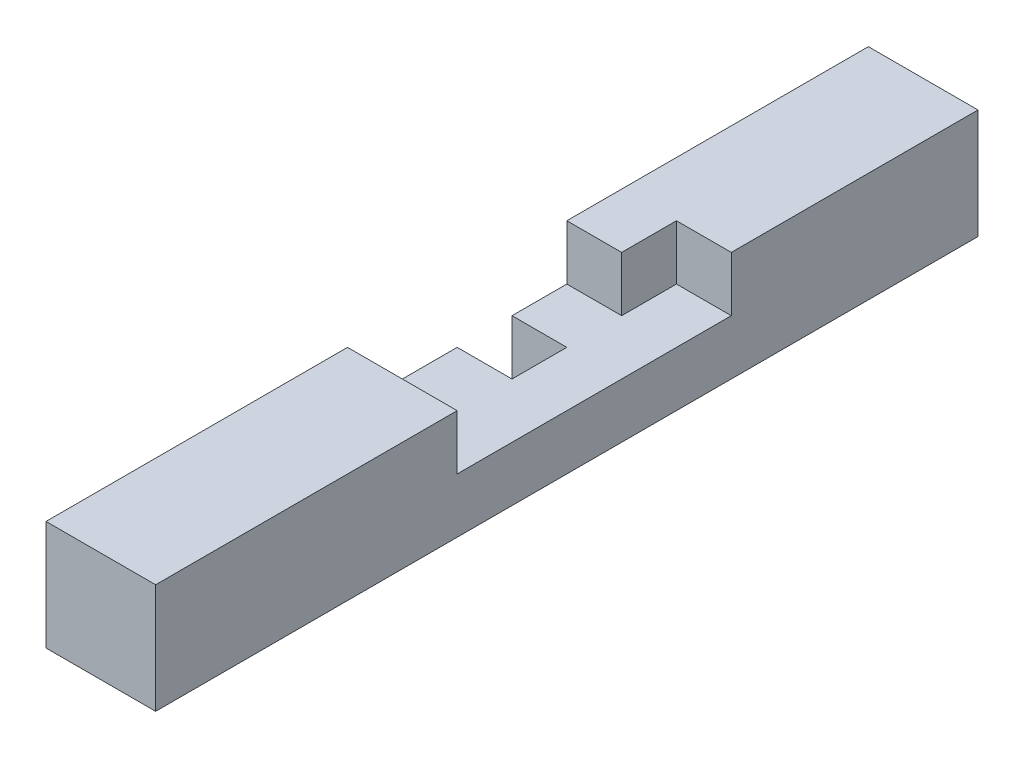
ISO-10303-21;
HEADER;
FILE_DESCRIPTION(('STEP AP214'),'2;1');
FILE_NAME('part.step','',(''),(''),'','','');
FILE_SCHEMA(('AUTOMOTIVE_DESIGN { 1 0 10303 214 1 1 1 1 }'));
ENDSEC;
DATA;
#1=APPLICATION_CONTEXT('core data for automotive mechanical design processes');
#2=APPLICATION_PROTOCOL_DEFINITION('international standard','automotive_design',2000,#1);
#3=PRODUCT_CONTEXT('',#1,'mechanical');
#4=PRODUCT('Part','Part','',(#3));
#5=PRODUCT_RELATED_PRODUCT_CATEGORY('part','',(#4));
#6=PRODUCT_DEFINITION_FORMATION('','',#4);
#7=PRODUCT_DEFINITION_CONTEXT('part definition',#1,'design');
#8=PRODUCT_DEFINITION('design','',#6,#7);
#9=PRODUCT_DEFINITION_SHAPE('','',#8);
#10=(LENGTH_UNIT() NAMED_UNIT(*) SI_UNIT(.MILLI.,.METRE.));
#11=(NAMED_UNIT(*) PLANE_ANGLE_UNIT() SI_UNIT($,.RADIAN.));
#12=(NAMED_UNIT(*) SI_UNIT($,.STERADIAN.) SOLID_ANGLE_UNIT());
#13=UNCERTAINTY_MEASURE_WITH_UNIT(LENGTH_MEASURE(1.E-05),#10,'distance_accuracy_value','');
#14=(GEOMETRIC_REPRESENTATION_CONTEXT(3) GLOBAL_UNCERTAINTY_ASSIGNED_CONTEXT((#13)) GLOBAL_UNIT_ASSIGNED_CONTEXT((#10,
#11,#12)) REPRESENTATION_CONTEXT('',''));
#15=CARTESIAN_POINT('',(0.,0.,0.));
#16=DIRECTION('',(0.,0.,1.));
#17=DIRECTION('',(1.,0.,0.));
#18=AXIS2_PLACEMENT_3D('',#15,#16,#17);
#19=CARTESIAN_POINT('',(0.,0.,11.));
#20=DIRECTION('',(0.,0.,-1.));
#21=DIRECTION('',(-1.,0.,0.));
#22=AXIS2_PLACEMENT_3D('',#19,#20,#21);
#23=PLANE('',#22);
#24=DIRECTION('',(-1.,0.,0.));
#25=VECTOR('',#24,1.);
#26=CARTESIAN_POINT('',(0.,0.,11.));
#27=LINE('',#26,#25);
#28=CARTESIAN_POINT('',(0.,0.,11.));
#29=VERTEX_POINT('',#28);
#30=CARTESIAN_POINT('',(-2.,0.,11.));
#31=VERTEX_POINT('',#30);
#32=EDGE_CURVE('E147',#29,#31,#27,.T.);
#33=ORIENTED_EDGE('',*,*,#32,.F.);
#34=DIRECTION('',(0.,1.,0.));
#35=VECTOR('',#34,1.);
#36=CARTESIAN_POINT('',(0.,2.,11.));
#37=LINE('',#36,#35);
#38=CARTESIAN_POINT('',(0.,2.,11.));
#39=VERTEX_POINT('',#38);
#40=EDGE_CURVE('E412',#29,#39,#37,.T.);
#41=ORIENTED_EDGE('',*,*,#40,.T.);
#42=DIRECTION('',(-1.,0.,0.));
#43=VECTOR('',#42,1.);
#44=CARTESIAN_POINT('',(0.,2.,11.));
#45=LINE('',#44,#43);
#46=CARTESIAN_POINT('',(-2.,2.,11.));
#47=VERTEX_POINT('',#46);
#48=EDGE_CURVE('E165',#39,#47,#45,.T.);
#49=ORIENTED_EDGE('',*,*,#48,.T.);
#50=DIRECTION('',(0.,-1.,0.));
#51=VECTOR('',#50,1.);
#52=CARTESIAN_POINT('',(-2.,0.,11.));
#53=LINE('',#52,#51);
#54=EDGE_CURVE('E161',#47,#31,#53,.T.);
#55=ORIENTED_EDGE('',*,*,#54,.T.);
#56=EDGE_LOOP('',(#33,#41,#49,#55));
#57=FACE_BOUND('',#56,.T.);
#58=ADVANCED_FACE('F33',(#57),#23,.F.);
#59=CARTESIAN_POINT('',(0.,0.,0.));
#60=DIRECTION('',(-1.,0.,0.));
#61=DIRECTION('',(0.,-1.,0.));
#62=AXIS2_PLACEMENT_3D('',#59,#60,#61);
#63=PLANE('',#62);
#64=DIRECTION('',(0.,0.,1.));
#65=VECTOR('',#64,1.);
#66=CARTESIAN_POINT('',(0.,0.,11.));
#67=LINE('',#66,#65);
#68=CARTESIAN_POINT('',(0.,0.,13.));
#69=VERTEX_POINT('',#68);
#70=CARTESIAN_POINT('',(0.,0.,15.));
#71=VERTEX_POINT('',#70);
#72=EDGE_CURVE('E56',#69,#71,#67,.T.);
#73=ORIENTED_EDGE('',*,*,#72,.F.);
#74=DIRECTION('',(0.,1.,0.));
#75=VECTOR('',#74,1.);
#76=CARTESIAN_POINT('',(0.,0.,13.));
#77=LINE('',#76,#75);
#78=CARTESIAN_POINT('',(0.,-2.,13.));
#79=VERTEX_POINT('',#78);
#80=EDGE_CURVE('E142',#79,#69,#77,.T.);
#81=ORIENTED_EDGE('',*,*,#80,.F.);
#82=DIRECTION('',(0.,0.,1.));
#83=VECTOR('',#82,1.);
#84=CARTESIAN_POINT('',(0.,-2.,11.));
#85=LINE('',#84,#83);
#86=CARTESIAN_POINT('',(0.,-2.,15.));
#87=VERTEX_POINT('',#86);
#88=EDGE_CURVE('E157',#79,#87,#85,.T.);
#89=ORIENTED_EDGE('',*,*,#88,.T.);
#90=DIRECTION('',(0.,-1.,0.));
#91=VECTOR('',#90,1.);
#92=CARTESIAN_POINT('',(0.,0.,15.));
#93=LINE('',#92,#91);
#94=EDGE_CURVE('E151',#71,#87,#93,.T.);
#95=ORIENTED_EDGE('',*,*,#94,.F.);
#96=EDGE_LOOP('',(#73,#81,#89,#95));
#97=FACE_BOUND('',#96,.T.);
#98=ADVANCED_FACE('F149',(#97),#63,.T.);
#99=CARTESIAN_POINT('',(2.,2.,9.));
#100=DIRECTION('',(0.,0.,-1.));
#101=DIRECTION('',(-1.,0.,0.));
#102=AXIS2_PLACEMENT_3D('',#99,#100,#101);
#103=PLANE('',#102);
#104=DIRECTION('',(0.,-1.,0.));
#105=VECTOR('',#104,1.);
#106=CARTESIAN_POINT('',(0.,2.,9.));
#107=LINE('',#106,#105);
#108=CARTESIAN_POINT('',(0.,2.,9.));
#109=VERTEX_POINT('',#108);
#110=CARTESIAN_POINT('',(0.,0.,9.));
#111=VERTEX_POINT('',#110);
#112=EDGE_CURVE('E409',#109,#111,#107,.T.);
#113=ORIENTED_EDGE('',*,*,#112,.T.);
#114=DIRECTION('',(-1.,0.,0.));
#115=VECTOR('',#114,1.);
#116=CARTESIAN_POINT('',(2.,0.,9.));
#117=LINE('',#116,#115);
#118=CARTESIAN_POINT('',(2.,0.,9.));
#119=VERTEX_POINT('',#118);
#120=EDGE_CURVE('E180',#119,#111,#117,.T.);
#121=ORIENTED_EDGE('',*,*,#120,.F.);
#122=DIRECTION('',(0.,-1.,0.));
#123=VECTOR('',#122,1.);
#124=CARTESIAN_POINT('',(2.,2.,9.));
#125=LINE('',#124,#123);
#126=CARTESIAN_POINT('',(2.,2.,9.));
#127=VERTEX_POINT('',#126);
#128=EDGE_CURVE('E170',#127,#119,#125,.T.);
#129=ORIENTED_EDGE('',*,*,#128,.F.);
#130=DIRECTION('',(-1.,0.,0.));
#131=VECTOR('',#130,1.);
#132=CARTESIAN_POINT('',(2.,2.,9.));
#133=LINE('',#132,#131);
#134=EDGE_CURVE('E183',#127,#109,#133,.T.);
#135=ORIENTED_EDGE('',*,*,#134,.T.);
#136=EDGE_LOOP('',(#113,#121,#129,#135));
#137=FACE_BOUND('',#136,.T.);
#138=ADVANCED_FACE('F261',(#137),#103,.F.);
#139=CARTESIAN_POINT('',(2.,0.,9.));
#140=DIRECTION('',(0.,-1.,0.));
#141=DIRECTION('',(1.,0.,0.));
#142=AXIS2_PLACEMENT_3D('',#139,#140,#141);
#143=PLANE('',#142);
#144=DIRECTION('',(0.,0.,1.));
#145=VECTOR('',#144,1.);
#146=CARTESIAN_POINT('',(0.,0.,9.));
#147=LINE('',#146,#145);
#148=EDGE_CURVE('E407',#111,#29,#147,.T.);
#149=ORIENTED_EDGE('',*,*,#148,.T.);
#150=ORIENTED_EDGE('',*,*,#32,.T.);
#151=DIRECTION('',(0.,0.,-1.));
#152=VECTOR('',#151,1.);
#153=CARTESIAN_POINT('',(-2.,0.,13.));
#154=LINE('',#153,#152);
#155=CARTESIAN_POINT('',(-2.,0.,13.));
#156=VERTEX_POINT('',#155);
#157=EDGE_CURVE('E139',#156,#31,#154,.T.);
#158=ORIENTED_EDGE('',*,*,#157,.F.);
#159=DIRECTION('',(-1.,0.,0.));
#160=VECTOR('',#159,1.);
#161=CARTESIAN_POINT('',(0.,0.,13.));
#162=LINE('',#161,#160);
#163=EDGE_CURVE('E135',#69,#156,#162,.T.);
#164=ORIENTED_EDGE('',*,*,#163,.F.);
#165=ORIENTED_EDGE('',*,*,#72,.T.);
#166=DIRECTION('',(-1.,0.,0.));
#167=VECTOR('',#166,1.);
#168=CARTESIAN_POINT('',(0.,0.,15.));
#169=LINE('',#168,#167);
#170=CARTESIAN_POINT('',(-2.,0.,15.));
#171=VERTEX_POINT('',#170);
#172=EDGE_CURVE('E155',#71,#171,#169,.T.);
#173=ORIENTED_EDGE('',*,*,#172,.T.);
#174=DIRECTION('',(0.,0.,1.));
#175=VECTOR('',#174,1.);
#176=CARTESIAN_POINT('',(-2.,0.,9.));
#177=LINE('',#176,#175);
#178=CARTESIAN_POINT('',(-2.,0.,19.));
#179=VERTEX_POINT('',#178);
#180=EDGE_CURVE('E168',#171,#179,#177,.T.);
#181=ORIENTED_EDGE('',*,*,#180,.T.);
#182=DIRECTION('',(-1.,0.,0.));
#183=VECTOR('',#182,1.);
#184=CARTESIAN_POINT('',(2.,0.,19.));
#185=LINE('',#184,#183);
#186=CARTESIAN_POINT('',(2.,0.,19.));
#187=VERTEX_POINT('',#186);
#188=EDGE_CURVE('E190',#187,#179,#185,.T.);
#189=ORIENTED_EDGE('',*,*,#188,.F.);
#190=DIRECTION('',(0.,0.,1.));
#191=VECTOR('',#190,1.);
#192=CARTESIAN_POINT('',(2.,0.,9.));
#193=LINE('',#192,#191);
#194=EDGE_CURVE('E173',#119,#187,#193,.T.);
#195=ORIENTED_EDGE('',*,*,#194,.F.);
#196=ORIENTED_EDGE('',*,*,#120,.T.);
#197=EDGE_LOOP('',(#149,#150,#158,#164,#165,#173,#181,#189,#195,#196));
#198=FACE_BOUND('',#197,.T.);
#199=ADVANCED_FACE('F137',(#198),#143,.F.);
#200=CARTESIAN_POINT('',(-2.,2.,30.));
#201=DIRECTION('',(1.,0.,0.));
#202=DIRECTION('',(0.,1.,0.));
#203=AXIS2_PLACEMENT_3D('',#200,#201,#202);
#204=PLANE('',#203);
#205=DIRECTION('',(0.,-1.,0.));
#206=VECTOR('',#205,1.);
#207=CARTESIAN_POINT('',(-2.,0.,15.));
#208=LINE('',#207,#206);
#209=CARTESIAN_POINT('',(-2.,-2.,15.));
#210=VERTEX_POINT('',#209);
#211=EDGE_CURVE('E164',#171,#210,#208,.T.);
#212=ORIENTED_EDGE('',*,*,#211,.T.);
#213=DIRECTION('',(0.,0.,-1.));
#214=VECTOR('',#213,1.);
#215=CARTESIAN_POINT('',(-2.,-2.,30.));
#216=LINE('',#215,#214);
#217=CARTESIAN_POINT('',(-2.,-2.,30.));
#218=VERTEX_POINT('',#217);
#219=EDGE_CURVE('E11',#218,#210,#216,.T.);
#220=ORIENTED_EDGE('',*,*,#219,.F.);
#221=DIRECTION('',(0.,-1.,0.));
#222=VECTOR('',#221,1.);
#223=CARTESIAN_POINT('',(-2.,2.,30.));
#224=LINE('',#223,#222);
#225=CARTESIAN_POINT('',(-2.,2.,30.));
#226=VERTEX_POINT('',#225);
#227=EDGE_CURVE('E195',#226,#218,#224,.T.);
#228=ORIENTED_EDGE('',*,*,#227,.F.);
#229=DIRECTION('',(0.,0.,-1.));
#230=VECTOR('',#229,1.);
#231=CARTESIAN_POINT('',(-2.,2.,30.));
#232=LINE('',#231,#230);
#233=CARTESIAN_POINT('',(-2.,2.,19.));
#234=VERTEX_POINT('',#233);
#235=EDGE_CURVE('E218',#226,#234,#232,.T.);
#236=ORIENTED_EDGE('',*,*,#235,.T.);
#237=DIRECTION('',(0.,1.,0.));
#238=VECTOR('',#237,1.);
#239=CARTESIAN_POINT('',(-2.,2.,19.));
#240=LINE('',#239,#238);
#241=EDGE_CURVE('E174',#179,#234,#240,.T.);
#242=ORIENTED_EDGE('',*,*,#241,.F.);
#243=ORIENTED_EDGE('',*,*,#180,.F.);
#244=EDGE_LOOP('',(#212,#220,#228,#236,#242,#243));
#245=FACE_BOUND('',#244,.T.);
#246=ADVANCED_FACE('F272',(#245),#204,.F.);
#247=CARTESIAN_POINT('',(-2.,2.,30.));
#248=DIRECTION('',(0.,1.,0.));
#249=DIRECTION('',(0.,0.,1.));
#250=AXIS2_PLACEMENT_3D('',#247,#248,#249);
#251=PLANE('',#250);
#252=ORIENTED_EDGE('',*,*,#134,.F.);
#253=DIRECTION('',(0.,0.,-1.));
#254=VECTOR('',#253,1.);
#255=CARTESIAN_POINT('',(2.,2.,30.));
#256=LINE('',#255,#254);
#257=CARTESIAN_POINT('',(2.,2.,0.));
#258=VERTEX_POINT('',#257);
#259=EDGE_CURVE('E221',#127,#258,#256,.T.);
#260=ORIENTED_EDGE('',*,*,#259,.T.);
#261=DIRECTION('',(1.,0.,0.));
#262=VECTOR('',#261,1.);
#263=CARTESIAN_POINT('',(-2.,2.,0.));
#264=LINE('',#263,#262);
#265=CARTESIAN_POINT('',(-2.,2.,0.));
#266=VERTEX_POINT('',#265);
#267=EDGE_CURVE('E199',#266,#258,#264,.T.);
#268=ORIENTED_EDGE('',*,*,#267,.F.);
#269=EDGE_CURVE('E207',#47,#266,#232,.T.);
#270=ORIENTED_EDGE('',*,*,#269,.F.);
#271=ORIENTED_EDGE('',*,*,#48,.F.);
#272=DIRECTION('',(0.,0.,-1.));
#273=VECTOR('',#272,1.);
#274=CARTESIAN_POINT('',(0.,2.,9.));
#275=LINE('',#274,#273);
#276=EDGE_CURVE('E418',#39,#109,#275,.T.);
#277=ORIENTED_EDGE('',*,*,#276,.T.);
#278=EDGE_LOOP('',(#252,#260,#268,#270,#271,#277));
#279=FACE_BOUND('',#278,.T.);
#280=ADVANCED_FACE('F240',(#279),#251,.T.);
#281=CARTESIAN_POINT('',(-2.,-2.,13.));
#282=VERTEX_POINT('',#281);
#283=CARTESIAN_POINT('',(-2.,-2.,0.));
#284=VERTEX_POINT('',#283);
#285=EDGE_CURVE('E41',#282,#284,#216,.T.);
#286=ORIENTED_EDGE('',*,*,#285,.F.);
#287=DIRECTION('',(0.,-1.,0.));
#288=VECTOR('',#287,1.);
#289=CARTESIAN_POINT('',(-2.,0.,13.));
#290=LINE('',#289,#288);
#291=EDGE_CURVE('E141',#156,#282,#290,.T.);
#292=ORIENTED_EDGE('',*,*,#291,.F.);
#293=ORIENTED_EDGE('',*,*,#157,.T.);
#294=ORIENTED_EDGE('',*,*,#54,.F.);
#295=ORIENTED_EDGE('',*,*,#269,.T.);
#296=DIRECTION('',(0.,-1.,0.));
#297=VECTOR('',#296,1.);
#298=CARTESIAN_POINT('',(-2.,2.,0.));
#299=LINE('',#298,#297);
#300=EDGE_CURVE('E186',#266,#284,#299,.T.);
#301=ORIENTED_EDGE('',*,*,#300,.T.);
#302=EDGE_LOOP('',(#286,#292,#293,#294,#295,#301));
#303=FACE_BOUND('',#302,.T.);
#304=ADVANCED_FACE('F35',(#303),#204,.F.);
#305=CARTESIAN_POINT('',(-2.,-2.,30.));
#306=DIRECTION('',(0.,1.,0.));
#307=DIRECTION('',(0.,0.,1.));
#308=AXIS2_PLACEMENT_3D('',#305,#306,#307);
#309=PLANE('',#308);
#310=DIRECTION('',(1.,0.,0.));
#311=VECTOR('',#310,1.);
#312=CARTESIAN_POINT('',(0.,-2.,13.));
#313=LINE('',#312,#311);
#314=EDGE_CURVE('E48',#282,#79,#313,.T.);
#315=ORIENTED_EDGE('',*,*,#314,.F.);
#316=ORIENTED_EDGE('',*,*,#285,.T.);
#317=DIRECTION('',(1.,0.,0.));
#318=VECTOR('',#317,1.);
#319=CARTESIAN_POINT('',(-2.,-2.,0.));
#320=LINE('',#319,#318);
#321=CARTESIAN_POINT('',(2.,-2.,0.));
#322=VERTEX_POINT('',#321);
#323=EDGE_CURVE('E210',#284,#322,#320,.T.);
#324=ORIENTED_EDGE('',*,*,#323,.T.);
#325=DIRECTION('',(0.,0.,-1.));
#326=VECTOR('',#325,1.);
#327=CARTESIAN_POINT('',(2.,-2.,30.));
#328=LINE('',#327,#326);
#329=CARTESIAN_POINT('',(2.,-2.,30.));
#330=VERTEX_POINT('',#329);
#331=EDGE_CURVE('E224',#330,#322,#328,.T.);
#332=ORIENTED_EDGE('',*,*,#331,.F.);
#333=DIRECTION('',(1.,0.,0.));
#334=VECTOR('',#333,1.);
#335=CARTESIAN_POINT('',(-2.,-2.,30.));
#336=LINE('',#335,#334);
#337=EDGE_CURVE('E198',#218,#330,#336,.T.);
#338=ORIENTED_EDGE('',*,*,#337,.F.);
#339=ORIENTED_EDGE('',*,*,#219,.T.);
#340=DIRECTION('',(-1.,0.,0.));
#341=VECTOR('',#340,1.);
#342=CARTESIAN_POINT('',(0.,-2.,15.));
#343=LINE('',#342,#341);
#344=EDGE_CURVE('E153',#87,#210,#343,.T.);
#345=ORIENTED_EDGE('',*,*,#344,.F.);
#346=ORIENTED_EDGE('',*,*,#88,.F.);
#347=EDGE_LOOP('',(#315,#316,#324,#332,#338,#339,#345,#346));
#348=FACE_BOUND('',#347,.T.);
#349=ADVANCED_FACE('F230',(#348),#309,.F.);
#350=CARTESIAN_POINT('',(2.,2.,30.));
#351=DIRECTION('',(1.,0.,0.));
#352=DIRECTION('',(0.,1.,0.));
#353=AXIS2_PLACEMENT_3D('',#350,#351,#352);
#354=PLANE('',#353);
#355=ORIENTED_EDGE('',*,*,#128,.T.);
#356=ORIENTED_EDGE('',*,*,#194,.T.);
#357=DIRECTION('',(0.,1.,0.));
#358=VECTOR('',#357,1.);
#359=CARTESIAN_POINT('',(2.,2.,19.));
#360=LINE('',#359,#358);
#361=CARTESIAN_POINT('',(2.,2.,19.));
#362=VERTEX_POINT('',#361);
#363=EDGE_CURVE('E177',#187,#362,#360,.T.);
#364=ORIENTED_EDGE('',*,*,#363,.T.);
#365=CARTESIAN_POINT('',(2.,2.,30.));
#366=VERTEX_POINT('',#365);
#367=EDGE_CURVE('E222',#366,#362,#256,.T.);
#368=ORIENTED_EDGE('',*,*,#367,.F.);
#369=DIRECTION('',(0.,-1.,0.));
#370=VECTOR('',#369,1.);
#371=CARTESIAN_POINT('',(2.,2.,30.));
#372=LINE('',#371,#370);
#373=EDGE_CURVE('E201',#366,#330,#372,.T.);
#374=ORIENTED_EDGE('',*,*,#373,.T.);
#375=ORIENTED_EDGE('',*,*,#331,.T.);
#376=DIRECTION('',(0.,-1.,0.));
#377=VECTOR('',#376,1.);
#378=CARTESIAN_POINT('',(2.,2.,0.));
#379=LINE('',#378,#377);
#380=EDGE_CURVE('E213',#258,#322,#379,.T.);
#381=ORIENTED_EDGE('',*,*,#380,.F.);
#382=ORIENTED_EDGE('',*,*,#259,.F.);
#383=EDGE_LOOP('',(#355,#356,#364,#368,#374,#375,#381,#382));
#384=FACE_BOUND('',#383,.T.);
#385=ADVANCED_FACE('F244',(#384),#354,.T.);
#386=DIRECTION('',(-1.,0.,0.));
#387=VECTOR('',#386,1.);
#388=CARTESIAN_POINT('',(2.,2.,19.));
#389=LINE('',#388,#387);
#390=EDGE_CURVE('E187',#362,#234,#389,.T.);
#391=ORIENTED_EDGE('',*,*,#390,.T.);
#392=ORIENTED_EDGE('',*,*,#235,.F.);
#393=DIRECTION('',(1.,0.,0.));
#394=VECTOR('',#393,1.);
#395=CARTESIAN_POINT('',(-2.,2.,30.));
#396=LINE('',#395,#394);
#397=EDGE_CURVE('E204',#226,#366,#396,.T.);
#398=ORIENTED_EDGE('',*,*,#397,.T.);
#399=ORIENTED_EDGE('',*,*,#367,.T.);
#400=EDGE_LOOP('',(#391,#392,#398,#399));
#401=FACE_BOUND('',#400,.T.);
#402=ADVANCED_FACE('F246',(#401),#251,.T.);
#403=CARTESIAN_POINT('',(0.,0.,30.));
#404=DIRECTION('',(0.,0.,1.));
#405=DIRECTION('',(1.,0.,0.));
#406=AXIS2_PLACEMENT_3D('',#403,#404,#405);
#407=PLANE('',#406);
#408=ORIENTED_EDGE('',*,*,#227,.T.);
#409=ORIENTED_EDGE('',*,*,#337,.T.);
#410=ORIENTED_EDGE('',*,*,#373,.F.);
#411=ORIENTED_EDGE('',*,*,#397,.F.);
#412=EDGE_LOOP('',(#408,#409,#410,#411));
#413=FACE_BOUND('',#412,.T.);
#414=ADVANCED_FACE('F252',(#413),#407,.T.);
#415=CARTESIAN_POINT('',(0.,0.,0.));
#416=DIRECTION('',(0.,0.,1.));
#417=DIRECTION('',(1.,0.,0.));
#418=AXIS2_PLACEMENT_3D('',#415,#416,#417);
#419=PLANE('',#418);
#420=ORIENTED_EDGE('',*,*,#300,.F.);
#421=ORIENTED_EDGE('',*,*,#267,.T.);
#422=ORIENTED_EDGE('',*,*,#380,.T.);
#423=ORIENTED_EDGE('',*,*,#323,.F.);
#424=EDGE_LOOP('',(#420,#421,#422,#423));
#425=FACE_BOUND('',#424,.T.);
#426=ADVANCED_FACE('F234',(#425),#419,.F.);
#427=CARTESIAN_POINT('',(2.,2.,19.));
#428=DIRECTION('',(0.,0.,1.));
#429=DIRECTION('',(1.,0.,0.));
#430=AXIS2_PLACEMENT_3D('',#427,#428,#429);
#431=PLANE('',#430);
#432=ORIENTED_EDGE('',*,*,#241,.T.);
#433=ORIENTED_EDGE('',*,*,#390,.F.);
#434=ORIENTED_EDGE('',*,*,#363,.F.);
#435=ORIENTED_EDGE('',*,*,#188,.T.);
#436=EDGE_LOOP('',(#432,#433,#434,#435));
#437=FACE_BOUND('',#436,.T.);
#438=ADVANCED_FACE('F266',(#437),#431,.F.);
#439=CARTESIAN_POINT('',(0.,0.,15.));
#440=DIRECTION('',(0.,0.,-1.));
#441=DIRECTION('',(-1.,0.,0.));
#442=AXIS2_PLACEMENT_3D('',#439,#440,#441);
#443=PLANE('',#442);
#444=ORIENTED_EDGE('',*,*,#211,.F.);
#445=ORIENTED_EDGE('',*,*,#172,.F.);
#446=ORIENTED_EDGE('',*,*,#94,.T.);
#447=ORIENTED_EDGE('',*,*,#344,.T.);
#448=EDGE_LOOP('',(#444,#445,#446,#447));
#449=FACE_BOUND('',#448,.T.);
#450=ADVANCED_FACE('F265',(#449),#443,.T.);
#451=CARTESIAN_POINT('',(0.,0.,0.));
#452=DIRECTION('',(-1.,0.,0.));
#453=DIRECTION('',(0.,-1.,0.));
#454=AXIS2_PLACEMENT_3D('',#451,#452,#453);
#455=PLANE('',#454);
#456=ORIENTED_EDGE('',*,*,#112,.F.);
#457=ORIENTED_EDGE('',*,*,#276,.F.);
#458=ORIENTED_EDGE('',*,*,#40,.F.);
#459=ORIENTED_EDGE('',*,*,#148,.F.);
#460=EDGE_LOOP('',(#456,#457,#458,#459));
#461=FACE_BOUND('',#460,.T.);
#462=ADVANCED_FACE('F296',(#461),#455,.F.);
#463=CARTESIAN_POINT('',(0.,0.,13.));
#464=DIRECTION('',(0.,0.,-1.));
#465=DIRECTION('',(-1.,0.,0.));
#466=AXIS2_PLACEMENT_3D('',#463,#464,#465);
#467=PLANE('',#466);
#468=ORIENTED_EDGE('',*,*,#80,.T.);
#469=ORIENTED_EDGE('',*,*,#163,.T.);
#470=ORIENTED_EDGE('',*,*,#291,.T.);
#471=ORIENTED_EDGE('',*,*,#314,.T.);
#472=EDGE_LOOP('',(#468,#469,#470,#471));
#473=FACE_BOUND('',#472,.T.);
#474=ADVANCED_FACE('F144',(#473),#467,.F.);
#475=CLOSED_SHELL('',(#58,#98,#138,#199,#246,#280,#304,#349,#385,#402,#414,#426,#438,#450,#462,#474));
#476=MANIFOLD_SOLID_BREP('B2',#475);
#477=ADVANCED_BREP_SHAPE_REPRESENTATION('',(#18,#476),#14);
#478=SHAPE_DEFINITION_REPRESENTATION(#9,#477);
ENDSEC;
END-ISO-10303-21;
